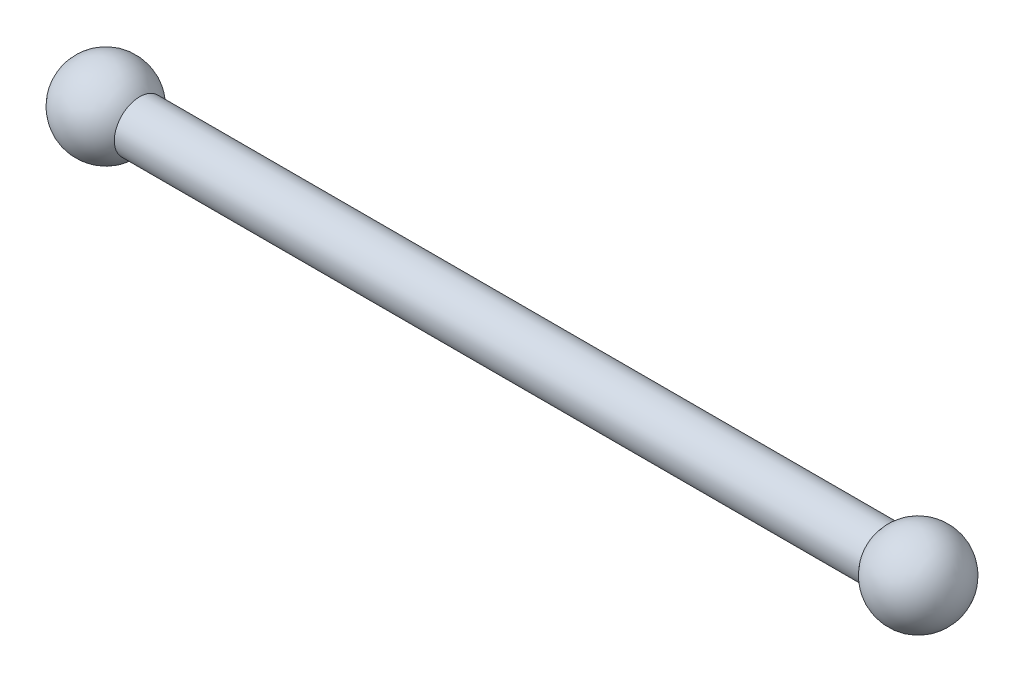
ISO-10303-21;
HEADER;
FILE_DESCRIPTION(('STEP AP214'),'2;1');
FILE_NAME('part.step','',(''),(''),'','','');
FILE_SCHEMA(('AUTOMOTIVE_DESIGN { 1 0 10303 214 1 1 1 1 }'));
ENDSEC;
DATA;
#1=APPLICATION_CONTEXT('core data for automotive mechanical design processes');
#2=APPLICATION_PROTOCOL_DEFINITION('international standard','automotive_design',2000,#1);
#3=PRODUCT_CONTEXT('',#1,'mechanical');
#4=PRODUCT('Part','Part','',(#3));
#5=PRODUCT_RELATED_PRODUCT_CATEGORY('part','',(#4));
#6=PRODUCT_DEFINITION_FORMATION('','',#4);
#7=PRODUCT_DEFINITION_CONTEXT('part definition',#1,'design');
#8=PRODUCT_DEFINITION('design','',#6,#7);
#9=PRODUCT_DEFINITION_SHAPE('','',#8);
#10=(LENGTH_UNIT() NAMED_UNIT(*) SI_UNIT(.MILLI.,.METRE.));
#11=(NAMED_UNIT(*) PLANE_ANGLE_UNIT() SI_UNIT($,.RADIAN.));
#12=(NAMED_UNIT(*) SI_UNIT($,.STERADIAN.) SOLID_ANGLE_UNIT());
#13=UNCERTAINTY_MEASURE_WITH_UNIT(LENGTH_MEASURE(1.E-05),#10,'distance_accuracy_value','');
#14=(GEOMETRIC_REPRESENTATION_CONTEXT(3) GLOBAL_UNCERTAINTY_ASSIGNED_CONTEXT((#13)) GLOBAL_UNIT_ASSIGNED_CONTEXT((#10,
#11,#12)) REPRESENTATION_CONTEXT('',''));
#15=CARTESIAN_POINT('',(0.,0.,0.));
#16=DIRECTION('',(0.,0.,1.));
#17=DIRECTION('',(1.,0.,0.));
#18=AXIS2_PLACEMENT_3D('',#15,#16,#17);
#19=CARTESIAN_POINT('',(48.,0.,-2.5));
#20=DIRECTION('',(-1.,0.,0.));
#21=DIRECTION('',(0.,0.,1.));
#22=AXIS2_PLACEMENT_3D('',#19,#20,#21);
#23=CYLINDRICAL_SURFACE('',#22,1.5);
#24=CARTESIAN_POINT('',(2.,0.,-2.5));
#25=DIRECTION('',(-1.,0.,0.));
#26=DIRECTION('',(0.,0.,1.));
#27=AXIS2_PLACEMENT_3D('',#24,#25,#26);
#28=CIRCLE('',#27,1.5);
#29=CARTESIAN_POINT('',(2.,0.,-1.));
#30=VERTEX_POINT('',#29);
#31=EDGE_CURVE('E41',#30,#30,#28,.T.);
#32=ORIENTED_EDGE('',*,*,#31,.F.);
#33=EDGE_LOOP('',(#32));
#34=FACE_BOUND('',#33,.T.);
#35=CARTESIAN_POINT('',(46.,0.,-2.5));
#36=DIRECTION('',(1.,0.,0.));
#37=DIRECTION('',(0.,0.,-1.));
#38=AXIS2_PLACEMENT_3D('',#35,#36,#37);
#39=CIRCLE('',#38,1.5);
#40=CARTESIAN_POINT('',(46.,0.,-4.));
#41=VERTEX_POINT('',#40);
#42=EDGE_CURVE('E10',#41,#41,#39,.F.);
#43=ORIENTED_EDGE('',*,*,#42,.T.);
#44=EDGE_LOOP('',(#43));
#45=FACE_BOUND('',#44,.T.);
#46=ADVANCED_FACE('F34',(#34,#45),#23,.T.);
#47=CARTESIAN_POINT('',(0.,0.,-2.5));
#48=DIRECTION('',(0.,1.,0.));
#49=DIRECTION('',(0.,0.,1.));
#50=AXIS2_PLACEMENT_3D('',#47,#48,#49);
#51=SPHERICAL_SURFACE('',#50,2.5);
#52=CARTESIAN_POINT('',(0.,0.,-2.5));
#53=DIRECTION('',(-1.,0.,0.));
#54=DIRECTION('',(0.,0.,1.));
#55=AXIS2_PLACEMENT_3D('',#52,#53,#54);
#56=SPHERICAL_SURFACE('',#55,2.5);
#57=ORIENTED_EDGE('',*,*,#31,.T.);
#58=EDGE_LOOP('',(#57));
#59=FACE_BOUND('',#58,.T.);
#60=ADVANCED_FACE('F36',(#59),#56,.T.);
#61=CARTESIAN_POINT('',(48.,0.,-2.5));
#62=DIRECTION('',(0.,1.,0.));
#63=DIRECTION('',(0.,0.,1.));
#64=AXIS2_PLACEMENT_3D('',#61,#62,#63);
#65=SPHERICAL_SURFACE('',#64,2.5);
#66=CARTESIAN_POINT('',(48.,0.,-2.5));
#67=DIRECTION('',(1.,0.,0.));
#68=DIRECTION('',(0.,0.,-1.));
#69=AXIS2_PLACEMENT_3D('',#66,#67,#68);
#70=SPHERICAL_SURFACE('',#69,2.5);
#71=ORIENTED_EDGE('',*,*,#42,.F.);
#72=EDGE_LOOP('',(#71));
#73=FACE_BOUND('',#72,.T.);
#74=ADVANCED_FACE('F52',(#73),#70,.T.);
#75=CLOSED_SHELL('',(#46,#60,#74));
#76=MANIFOLD_SOLID_BREP('B2',#75);
#77=ADVANCED_BREP_SHAPE_REPRESENTATION('',(#18,#76),#14);
#78=SHAPE_DEFINITION_REPRESENTATION(#9,#77);
ENDSEC;
END-ISO-10303-21;
